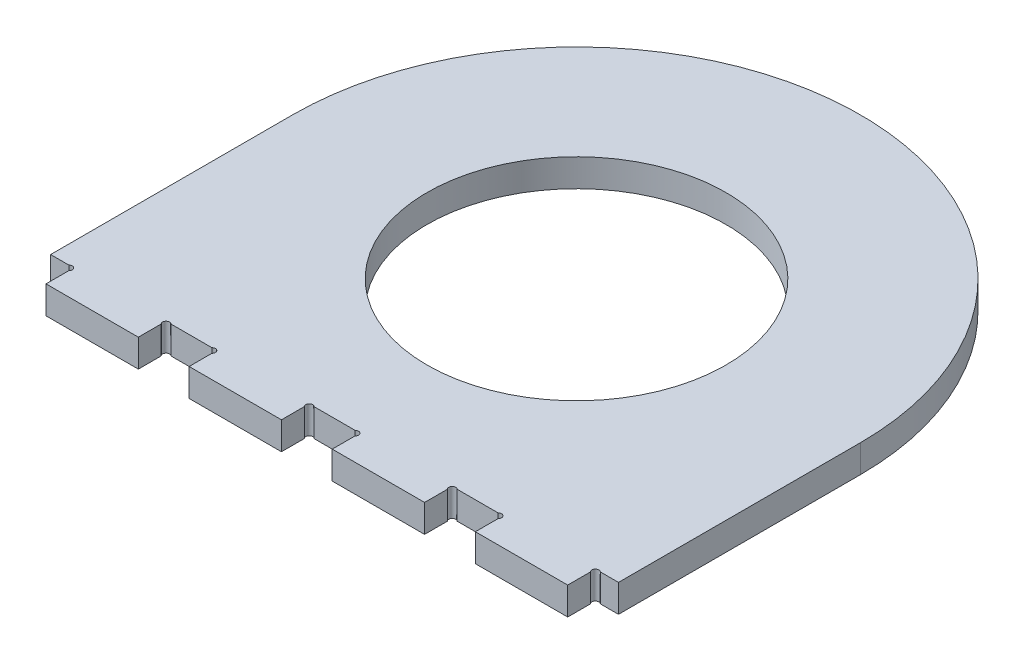
ISO-10303-21;
HEADER;
FILE_DESCRIPTION(('STEP AP214'),'2;1');
FILE_NAME('part.step','',(''),(''),'','','');
FILE_SCHEMA(('AUTOMOTIVE_DESIGN { 1 0 10303 214 1 1 1 1 }'));
ENDSEC;
DATA;
#1=APPLICATION_CONTEXT('core data for automotive mechanical design processes');
#2=APPLICATION_PROTOCOL_DEFINITION('international standard','automotive_design',2000,#1);
#3=PRODUCT_CONTEXT('',#1,'mechanical');
#4=PRODUCT('Part','Part','',(#3));
#5=PRODUCT_RELATED_PRODUCT_CATEGORY('part','',(#4));
#6=PRODUCT_DEFINITION_FORMATION('','',#4);
#7=PRODUCT_DEFINITION_CONTEXT('part definition',#1,'design');
#8=PRODUCT_DEFINITION('design','',#6,#7);
#9=PRODUCT_DEFINITION_SHAPE('','',#8);
#10=(LENGTH_UNIT() NAMED_UNIT(*) SI_UNIT(.MILLI.,.METRE.));
#11=(NAMED_UNIT(*) PLANE_ANGLE_UNIT() SI_UNIT($,.RADIAN.));
#12=(NAMED_UNIT(*) SI_UNIT($,.STERADIAN.) SOLID_ANGLE_UNIT());
#13=UNCERTAINTY_MEASURE_WITH_UNIT(LENGTH_MEASURE(1.E-05),#10,'distance_accuracy_value','');
#14=(GEOMETRIC_REPRESENTATION_CONTEXT(3) GLOBAL_UNCERTAINTY_ASSIGNED_CONTEXT((#13)) GLOBAL_UNIT_ASSIGNED_CONTEXT((#10,
#11,#12)) REPRESENTATION_CONTEXT('',''));
#15=CARTESIAN_POINT('',(0.,0.,0.));
#16=DIRECTION('',(0.,0.,1.));
#17=DIRECTION('',(1.,0.,0.));
#18=AXIS2_PLACEMENT_3D('',#15,#16,#17);
#19=CARTESIAN_POINT('',(180.,12.,-104.820295073944));
#20=DIRECTION('',(0.,1.,0.));
#21=DIRECTION('',(0.,0.,1.));
#22=AXIS2_PLACEMENT_3D('',#19,#20,#21);
#23=PLANE('',#22);
#24=DIRECTION('',(0.,0.,-1.));
#25=VECTOR('',#24,1.);
#26=CARTESIAN_POINT('',(303.,12.,0.));
#27=LINE('',#26,#25);
#28=CARTESIAN_POINT('',(303.,12.,0.));
#29=VERTEX_POINT('',#28);
#30=CARTESIAN_POINT('',(303.,12.,-104.820295073944));
#31=VERTEX_POINT('',#30);
#32=EDGE_CURVE('E304',#29,#31,#27,.T.);
#33=ORIENTED_EDGE('',*,*,#32,.T.);
#34=CARTESIAN_POINT('',(180.,12.,-104.820295073944));
#35=DIRECTION('',(0.,1.,0.));
#36=DIRECTION('',(0.,0.,1.));
#37=AXIS2_PLACEMENT_3D('',#34,#35,#36);
#38=CIRCLE('',#37,123.);
#39=CARTESIAN_POINT('',(57.,12.,-104.820295073944));
#40=VERTEX_POINT('',#39);
#41=EDGE_CURVE('E152',#31,#40,#38,.T.);
#42=ORIENTED_EDGE('',*,*,#41,.T.);
#43=DIRECTION('',(0.,0.,1.));
#44=VECTOR('',#43,1.);
#45=CARTESIAN_POINT('',(57.,12.,0.));
#46=LINE('',#45,#44);
#47=CARTESIAN_POINT('',(57.,12.,0.));
#48=VERTEX_POINT('',#47);
#49=EDGE_CURVE('E379',#40,#48,#46,.T.);
#50=ORIENTED_EDGE('',*,*,#49,.T.);
#51=DIRECTION('',(1.,0.,0.));
#52=VECTOR('',#51,1.);
#53=CARTESIAN_POINT('',(57.,12.,0.));
#54=LINE('',#53,#52);
#55=CARTESIAN_POINT('',(64.8786796564404,12.,0.));
#56=VERTEX_POINT('',#55);
#57=EDGE_CURVE('E398',#48,#56,#54,.T.);
#58=ORIENTED_EDGE('',*,*,#57,.T.);
#59=CARTESIAN_POINT('',(65.9393398282202,12.,1.06066017177982));
#60=DIRECTION('',(0.,-1.,0.));
#61=DIRECTION('',(0.,0.,1.));
#62=AXIS2_PLACEMENT_3D('',#59,#60,#61);
#63=CIRCLE('',#62,1.5);
#64=CARTESIAN_POINT('',(67.,12.,2.12132034355964));
#65=VERTEX_POINT('',#64);
#66=EDGE_CURVE('E395',#56,#65,#63,.T.);
#67=ORIENTED_EDGE('',*,*,#66,.T.);
#68=DIRECTION('',(0.,0.,1.));
#69=VECTOR('',#68,1.);
#70=CARTESIAN_POINT('',(67.,12.,2.12132034355964));
#71=LINE('',#70,#69);
#72=CARTESIAN_POINT('',(67.,12.,12.));
#73=VERTEX_POINT('',#72);
#74=EDGE_CURVE('E397',#65,#73,#71,.T.);
#75=ORIENTED_EDGE('',*,*,#74,.T.);
#76=DIRECTION('',(1.,0.,0.));
#77=VECTOR('',#76,1.);
#78=CARTESIAN_POINT('',(67.,12.,12.));
#79=LINE('',#78,#77);
#80=CARTESIAN_POINT('',(107.,12.,12.));
#81=VERTEX_POINT('',#80);
#82=EDGE_CURVE('E400',#73,#81,#79,.T.);
#83=ORIENTED_EDGE('',*,*,#82,.T.);
#84=DIRECTION('',(0.,0.,-1.));
#85=VECTOR('',#84,1.);
#86=CARTESIAN_POINT('',(107.,12.,12.));
#87=LINE('',#86,#85);
#88=CARTESIAN_POINT('',(107.,12.,2.12132034355962));
#89=VERTEX_POINT('',#88);
#90=EDGE_CURVE('E406',#81,#89,#87,.T.);
#91=ORIENTED_EDGE('',*,*,#90,.T.);
#92=CARTESIAN_POINT('',(108.06066017178,12.,1.06066017177981));
#93=DIRECTION('',(0.,-1.,0.));
#94=DIRECTION('',(0.,0.,1.));
#95=AXIS2_PLACEMENT_3D('',#92,#93,#94);
#96=CIRCLE('',#95,1.5);
#97=CARTESIAN_POINT('',(109.12132034356,12.,0.));
#98=VERTEX_POINT('',#97);
#99=EDGE_CURVE('E408',#89,#98,#96,.T.);
#100=ORIENTED_EDGE('',*,*,#99,.T.);
#101=DIRECTION('',(1.,0.,0.));
#102=VECTOR('',#101,1.);
#103=CARTESIAN_POINT('',(109.12132034356,12.,0.));
#104=LINE('',#103,#102);
#105=CARTESIAN_POINT('',(126.87867965644,12.,0.));
#106=VERTEX_POINT('',#105);
#107=EDGE_CURVE('E410',#98,#106,#104,.T.);
#108=ORIENTED_EDGE('',*,*,#107,.T.);
#109=CARTESIAN_POINT('',(127.93933982822,12.,1.06066017177981));
#110=DIRECTION('',(0.,-1.,0.));
#111=DIRECTION('',(0.,0.,1.));
#112=AXIS2_PLACEMENT_3D('',#109,#110,#111);
#113=CIRCLE('',#112,1.49999999999996);
#114=CARTESIAN_POINT('',(129.,12.,2.1213203435596));
#115=VERTEX_POINT('',#114);
#116=EDGE_CURVE('E412',#106,#115,#113,.T.);
#117=ORIENTED_EDGE('',*,*,#116,.T.);
#118=DIRECTION('',(0.,0.,1.));
#119=VECTOR('',#118,1.);
#120=CARTESIAN_POINT('',(129.,12.,2.1213203435596));
#121=LINE('',#120,#119);
#122=CARTESIAN_POINT('',(129.,12.,12.));
#123=VERTEX_POINT('',#122);
#124=EDGE_CURVE('E414',#115,#123,#121,.T.);
#125=ORIENTED_EDGE('',*,*,#124,.T.);
#126=DIRECTION('',(1.,0.,0.));
#127=VECTOR('',#126,1.);
#128=CARTESIAN_POINT('',(129.,12.,12.));
#129=LINE('',#128,#127);
#130=CARTESIAN_POINT('',(169.,12.,12.));
#131=VERTEX_POINT('',#130);
#132=EDGE_CURVE('E416',#123,#131,#129,.T.);
#133=ORIENTED_EDGE('',*,*,#132,.T.);
#134=DIRECTION('',(0.,0.,-1.));
#135=VECTOR('',#134,1.);
#136=CARTESIAN_POINT('',(169.,12.,12.));
#137=LINE('',#136,#135);
#138=CARTESIAN_POINT('',(169.,12.,2.12132034355962));
#139=VERTEX_POINT('',#138);
#140=EDGE_CURVE('E418',#131,#139,#137,.T.);
#141=ORIENTED_EDGE('',*,*,#140,.T.);
#142=CARTESIAN_POINT('',(170.06066017178,12.,1.06066017177981));
#143=DIRECTION('',(0.,-1.,0.));
#144=DIRECTION('',(0.,0.,1.));
#145=AXIS2_PLACEMENT_3D('',#142,#143,#144);
#146=CIRCLE('',#145,1.5);
#147=CARTESIAN_POINT('',(171.12132034356,12.,0.));
#148=VERTEX_POINT('',#147);
#149=EDGE_CURVE('E420',#139,#148,#146,.T.);
#150=ORIENTED_EDGE('',*,*,#149,.T.);
#151=DIRECTION('',(1.,0.,0.));
#152=VECTOR('',#151,1.);
#153=CARTESIAN_POINT('',(171.12132034356,12.,0.));
#154=LINE('',#153,#152);
#155=CARTESIAN_POINT('',(188.87867965644,12.,0.));
#156=VERTEX_POINT('',#155);
#157=EDGE_CURVE('E422',#148,#156,#154,.T.);
#158=ORIENTED_EDGE('',*,*,#157,.T.);
#159=CARTESIAN_POINT('',(189.93933982822,12.,1.06066017177981));
#160=DIRECTION('',(0.,-1.,0.));
#161=DIRECTION('',(0.,0.,1.));
#162=AXIS2_PLACEMENT_3D('',#159,#160,#161);
#163=CIRCLE('',#162,1.49999999999996);
#164=CARTESIAN_POINT('',(191.,12.,2.1213203435596));
#165=VERTEX_POINT('',#164);
#166=EDGE_CURVE('E424',#156,#165,#163,.T.);
#167=ORIENTED_EDGE('',*,*,#166,.T.);
#168=DIRECTION('',(0.,0.,1.));
#169=VECTOR('',#168,1.);
#170=CARTESIAN_POINT('',(191.,12.,2.1213203435596));
#171=LINE('',#170,#169);
#172=CARTESIAN_POINT('',(191.,12.,12.));
#173=VERTEX_POINT('',#172);
#174=EDGE_CURVE('E426',#165,#173,#171,.T.);
#175=ORIENTED_EDGE('',*,*,#174,.T.);
#176=DIRECTION('',(1.,0.,0.));
#177=VECTOR('',#176,1.);
#178=CARTESIAN_POINT('',(191.,12.,12.));
#179=LINE('',#178,#177);
#180=CARTESIAN_POINT('',(231.,12.,12.));
#181=VERTEX_POINT('',#180);
#182=EDGE_CURVE('E428',#173,#181,#179,.T.);
#183=ORIENTED_EDGE('',*,*,#182,.T.);
#184=DIRECTION('',(0.,0.,-1.));
#185=VECTOR('',#184,1.);
#186=CARTESIAN_POINT('',(231.,12.,12.));
#187=LINE('',#186,#185);
#188=CARTESIAN_POINT('',(231.,12.,2.12132034355962));
#189=VERTEX_POINT('',#188);
#190=EDGE_CURVE('E430',#181,#189,#187,.T.);
#191=ORIENTED_EDGE('',*,*,#190,.T.);
#192=CARTESIAN_POINT('',(232.06066017178,12.,1.06066017177981));
#193=DIRECTION('',(0.,-1.,0.));
#194=DIRECTION('',(0.,0.,1.));
#195=AXIS2_PLACEMENT_3D('',#192,#193,#194);
#196=CIRCLE('',#195,1.5);
#197=CARTESIAN_POINT('',(233.12132034356,12.,0.));
#198=VERTEX_POINT('',#197);
#199=EDGE_CURVE('E432',#189,#198,#196,.T.);
#200=ORIENTED_EDGE('',*,*,#199,.T.);
#201=DIRECTION('',(1.,0.,0.));
#202=VECTOR('',#201,1.);
#203=CARTESIAN_POINT('',(233.12132034356,12.,0.));
#204=LINE('',#203,#202);
#205=CARTESIAN_POINT('',(250.87867965644,12.,0.));
#206=VERTEX_POINT('',#205);
#207=EDGE_CURVE('E434',#198,#206,#204,.T.);
#208=ORIENTED_EDGE('',*,*,#207,.T.);
#209=CARTESIAN_POINT('',(251.93933982822,12.,1.06066017177981));
#210=DIRECTION('',(0.,-1.,0.));
#211=DIRECTION('',(0.,0.,1.));
#212=AXIS2_PLACEMENT_3D('',#209,#210,#211);
#213=CIRCLE('',#212,1.49999999999997);
#214=CARTESIAN_POINT('',(253.,12.,2.1213203435596));
#215=VERTEX_POINT('',#214);
#216=EDGE_CURVE('E436',#206,#215,#213,.T.);
#217=ORIENTED_EDGE('',*,*,#216,.T.);
#218=DIRECTION('',(0.,0.,1.));
#219=VECTOR('',#218,1.);
#220=CARTESIAN_POINT('',(253.,12.,2.1213203435596));
#221=LINE('',#220,#219);
#222=CARTESIAN_POINT('',(253.,12.,12.));
#223=VERTEX_POINT('',#222);
#224=EDGE_CURVE('E438',#215,#223,#221,.T.);
#225=ORIENTED_EDGE('',*,*,#224,.T.);
#226=DIRECTION('',(1.,0.,0.));
#227=VECTOR('',#226,1.);
#228=CARTESIAN_POINT('',(253.,12.,12.));
#229=LINE('',#228,#227);
#230=CARTESIAN_POINT('',(293.,12.,12.));
#231=VERTEX_POINT('',#230);
#232=EDGE_CURVE('E231',#223,#231,#229,.T.);
#233=ORIENTED_EDGE('',*,*,#232,.T.);
#234=DIRECTION('',(0.,0.,-1.));
#235=VECTOR('',#234,1.);
#236=CARTESIAN_POINT('',(293.,12.,12.));
#237=LINE('',#236,#235);
#238=CARTESIAN_POINT('',(293.,12.,2.12132034355962));
#239=VERTEX_POINT('',#238);
#240=EDGE_CURVE('E225',#231,#239,#237,.T.);
#241=ORIENTED_EDGE('',*,*,#240,.T.);
#242=CARTESIAN_POINT('',(294.06066017178,12.,1.06066017177981));
#243=DIRECTION('',(0.,-1.,0.));
#244=DIRECTION('',(0.,0.,1.));
#245=AXIS2_PLACEMENT_3D('',#242,#243,#244);
#246=CIRCLE('',#245,1.50000000000002);
#247=CARTESIAN_POINT('',(295.12132034356,12.,0.));
#248=VERTEX_POINT('',#247);
#249=EDGE_CURVE('E229',#239,#248,#246,.T.);
#250=ORIENTED_EDGE('',*,*,#249,.T.);
#251=DIRECTION('',(1.,0.,0.));
#252=VECTOR('',#251,1.);
#253=CARTESIAN_POINT('',(295.12132034356,12.,0.));
#254=LINE('',#253,#252);
#255=EDGE_CURVE('E49',#248,#29,#254,.T.);
#256=ORIENTED_EDGE('',*,*,#255,.T.);
#257=EDGE_LOOP('',(#33,#42,#50,#58,#67,#75,#83,#91,#100,#108,#117,#125,#133,#141,#150,#158,#167,
#175,#183,#191,#200,#208,#217,#225,#233,#241,#250,#256));
#258=FACE_BOUND('',#257,.T.);
#259=CARTESIAN_POINT('',(180.,12.,-104.820295073944));
#260=DIRECTION('',(0.,1.,0.));
#261=DIRECTION('',(0.,0.,1.));
#262=AXIS2_PLACEMENT_3D('',#259,#260,#261);
#263=CIRCLE('',#262,64.75);
#264=CARTESIAN_POINT('',(180.,12.,-40.0702950739442));
#265=VERTEX_POINT('',#264);
#266=EDGE_CURVE('E253',#265,#265,#263,.T.);
#267=ORIENTED_EDGE('',*,*,#266,.F.);
#268=EDGE_LOOP('',(#267));
#269=FACE_BOUND('',#268,.T.);
#270=ADVANCED_FACE('F32',(#258,#269),#23,.T.);
#271=CARTESIAN_POINT('',(180.,0.,-104.820295073944));
#272=DIRECTION('',(0.,1.,0.));
#273=DIRECTION('',(0.,0.,1.));
#274=AXIS2_PLACEMENT_3D('',#271,#272,#273);
#275=PLANE('',#274);
#276=DIRECTION('',(0.,0.,-1.));
#277=VECTOR('',#276,1.);
#278=CARTESIAN_POINT('',(303.,0.,0.));
#279=LINE('',#278,#277);
#280=CARTESIAN_POINT('',(303.,0.,0.));
#281=VERTEX_POINT('',#280);
#282=CARTESIAN_POINT('',(303.,0.,-104.820295073944));
#283=VERTEX_POINT('',#282);
#284=EDGE_CURVE('E249',#281,#283,#279,.T.);
#285=ORIENTED_EDGE('',*,*,#284,.F.);
#286=DIRECTION('',(1.,0.,0.));
#287=VECTOR('',#286,1.);
#288=CARTESIAN_POINT('',(295.12132034356,0.,0.));
#289=LINE('',#288,#287);
#290=CARTESIAN_POINT('',(295.12132034356,0.,0.));
#291=VERTEX_POINT('',#290);
#292=EDGE_CURVE('E144',#291,#281,#289,.T.);
#293=ORIENTED_EDGE('',*,*,#292,.F.);
#294=CARTESIAN_POINT('',(294.06066017178,0.,1.06066017177981));
#295=DIRECTION('',(0.,-1.,0.));
#296=DIRECTION('',(0.,0.,1.));
#297=AXIS2_PLACEMENT_3D('',#294,#295,#296);
#298=CIRCLE('',#297,1.50000000000002);
#299=CARTESIAN_POINT('',(293.,0.,2.12132034355962));
#300=VERTEX_POINT('',#299);
#301=EDGE_CURVE('E138',#300,#291,#298,.T.);
#302=ORIENTED_EDGE('',*,*,#301,.F.);
#303=DIRECTION('',(0.,0.,-1.));
#304=VECTOR('',#303,1.);
#305=CARTESIAN_POINT('',(293.,0.,12.));
#306=LINE('',#305,#304);
#307=CARTESIAN_POINT('',(293.,0.,12.));
#308=VERTEX_POINT('',#307);
#309=EDGE_CURVE('E239',#308,#300,#306,.T.);
#310=ORIENTED_EDGE('',*,*,#309,.F.);
#311=DIRECTION('',(1.,0.,0.));
#312=VECTOR('',#311,1.);
#313=CARTESIAN_POINT('',(253.,0.,12.));
#314=LINE('',#313,#312);
#315=CARTESIAN_POINT('',(253.,0.,12.));
#316=VERTEX_POINT('',#315);
#317=EDGE_CURVE('E299',#316,#308,#314,.T.);
#318=ORIENTED_EDGE('',*,*,#317,.F.);
#319=DIRECTION('',(0.,0.,1.));
#320=VECTOR('',#319,1.);
#321=CARTESIAN_POINT('',(253.,0.,2.1213203435596));
#322=LINE('',#321,#320);
#323=CARTESIAN_POINT('',(253.,0.,2.1213203435596));
#324=VERTEX_POINT('',#323);
#325=EDGE_CURVE('E297',#324,#316,#322,.T.);
#326=ORIENTED_EDGE('',*,*,#325,.F.);
#327=CARTESIAN_POINT('',(251.93933982822,0.,1.06066017177981));
#328=DIRECTION('',(0.,-1.,0.));
#329=DIRECTION('',(0.,0.,1.));
#330=AXIS2_PLACEMENT_3D('',#327,#328,#329);
#331=CIRCLE('',#330,1.49999999999997);
#332=CARTESIAN_POINT('',(250.87867965644,0.,0.));
#333=VERTEX_POINT('',#332);
#334=EDGE_CURVE('E295',#333,#324,#331,.T.);
#335=ORIENTED_EDGE('',*,*,#334,.F.);
#336=DIRECTION('',(1.,0.,0.));
#337=VECTOR('',#336,1.);
#338=CARTESIAN_POINT('',(233.12132034356,0.,0.));
#339=LINE('',#338,#337);
#340=CARTESIAN_POINT('',(233.12132034356,0.,0.));
#341=VERTEX_POINT('',#340);
#342=EDGE_CURVE('E293',#341,#333,#339,.T.);
#343=ORIENTED_EDGE('',*,*,#342,.F.);
#344=CARTESIAN_POINT('',(232.06066017178,0.,1.06066017177981));
#345=DIRECTION('',(0.,-1.,0.));
#346=DIRECTION('',(0.,0.,1.));
#347=AXIS2_PLACEMENT_3D('',#344,#345,#346);
#348=CIRCLE('',#347,1.5);
#349=CARTESIAN_POINT('',(231.,0.,2.12132034355962));
#350=VERTEX_POINT('',#349);
#351=EDGE_CURVE('E291',#350,#341,#348,.T.);
#352=ORIENTED_EDGE('',*,*,#351,.F.);
#353=DIRECTION('',(0.,0.,-1.));
#354=VECTOR('',#353,1.);
#355=CARTESIAN_POINT('',(231.,0.,12.));
#356=LINE('',#355,#354);
#357=CARTESIAN_POINT('',(231.,0.,12.));
#358=VERTEX_POINT('',#357);
#359=EDGE_CURVE('E289',#358,#350,#356,.T.);
#360=ORIENTED_EDGE('',*,*,#359,.F.);
#361=DIRECTION('',(1.,0.,0.));
#362=VECTOR('',#361,1.);
#363=CARTESIAN_POINT('',(191.,0.,12.));
#364=LINE('',#363,#362);
#365=CARTESIAN_POINT('',(191.,0.,12.));
#366=VERTEX_POINT('',#365);
#367=EDGE_CURVE('E287',#366,#358,#364,.T.);
#368=ORIENTED_EDGE('',*,*,#367,.F.);
#369=DIRECTION('',(0.,0.,1.));
#370=VECTOR('',#369,1.);
#371=CARTESIAN_POINT('',(191.,0.,2.1213203435596));
#372=LINE('',#371,#370);
#373=CARTESIAN_POINT('',(191.,0.,2.1213203435596));
#374=VERTEX_POINT('',#373);
#375=EDGE_CURVE('E285',#374,#366,#372,.T.);
#376=ORIENTED_EDGE('',*,*,#375,.F.);
#377=CARTESIAN_POINT('',(189.93933982822,0.,1.06066017177981));
#378=DIRECTION('',(0.,-1.,0.));
#379=DIRECTION('',(0.,0.,1.));
#380=AXIS2_PLACEMENT_3D('',#377,#378,#379);
#381=CIRCLE('',#380,1.49999999999996);
#382=CARTESIAN_POINT('',(188.87867965644,0.,0.));
#383=VERTEX_POINT('',#382);
#384=EDGE_CURVE('E283',#383,#374,#381,.T.);
#385=ORIENTED_EDGE('',*,*,#384,.F.);
#386=DIRECTION('',(1.,0.,0.));
#387=VECTOR('',#386,1.);
#388=CARTESIAN_POINT('',(171.12132034356,0.,0.));
#389=LINE('',#388,#387);
#390=CARTESIAN_POINT('',(171.12132034356,0.,0.));
#391=VERTEX_POINT('',#390);
#392=EDGE_CURVE('E281',#391,#383,#389,.T.);
#393=ORIENTED_EDGE('',*,*,#392,.F.);
#394=CARTESIAN_POINT('',(170.06066017178,0.,1.06066017177981));
#395=DIRECTION('',(0.,-1.,0.));
#396=DIRECTION('',(0.,0.,1.));
#397=AXIS2_PLACEMENT_3D('',#394,#395,#396);
#398=CIRCLE('',#397,1.5);
#399=CARTESIAN_POINT('',(169.,0.,2.12132034355962));
#400=VERTEX_POINT('',#399);
#401=EDGE_CURVE('E279',#400,#391,#398,.T.);
#402=ORIENTED_EDGE('',*,*,#401,.F.);
#403=DIRECTION('',(0.,0.,-1.));
#404=VECTOR('',#403,1.);
#405=CARTESIAN_POINT('',(169.,0.,12.));
#406=LINE('',#405,#404);
#407=CARTESIAN_POINT('',(169.,0.,12.));
#408=VERTEX_POINT('',#407);
#409=EDGE_CURVE('E277',#408,#400,#406,.T.);
#410=ORIENTED_EDGE('',*,*,#409,.F.);
#411=DIRECTION('',(1.,0.,0.));
#412=VECTOR('',#411,1.);
#413=CARTESIAN_POINT('',(129.,0.,12.));
#414=LINE('',#413,#412);
#415=CARTESIAN_POINT('',(129.,0.,12.));
#416=VERTEX_POINT('',#415);
#417=EDGE_CURVE('E275',#416,#408,#414,.T.);
#418=ORIENTED_EDGE('',*,*,#417,.F.);
#419=DIRECTION('',(0.,0.,1.));
#420=VECTOR('',#419,1.);
#421=CARTESIAN_POINT('',(129.,0.,2.1213203435596));
#422=LINE('',#421,#420);
#423=CARTESIAN_POINT('',(129.,0.,2.1213203435596));
#424=VERTEX_POINT('',#423);
#425=EDGE_CURVE('E273',#424,#416,#422,.T.);
#426=ORIENTED_EDGE('',*,*,#425,.F.);
#427=CARTESIAN_POINT('',(127.93933982822,0.,1.06066017177981));
#428=DIRECTION('',(0.,-1.,0.));
#429=DIRECTION('',(0.,0.,1.));
#430=AXIS2_PLACEMENT_3D('',#427,#428,#429);
#431=CIRCLE('',#430,1.49999999999996);
#432=CARTESIAN_POINT('',(126.87867965644,0.,0.));
#433=VERTEX_POINT('',#432);
#434=EDGE_CURVE('E271',#433,#424,#431,.T.);
#435=ORIENTED_EDGE('',*,*,#434,.F.);
#436=DIRECTION('',(1.,0.,0.));
#437=VECTOR('',#436,1.);
#438=CARTESIAN_POINT('',(109.12132034356,0.,0.));
#439=LINE('',#438,#437);
#440=CARTESIAN_POINT('',(109.12132034356,0.,0.));
#441=VERTEX_POINT('',#440);
#442=EDGE_CURVE('E269',#441,#433,#439,.T.);
#443=ORIENTED_EDGE('',*,*,#442,.F.);
#444=CARTESIAN_POINT('',(108.06066017178,0.,1.06066017177981));
#445=DIRECTION('',(0.,-1.,0.));
#446=DIRECTION('',(0.,0.,1.));
#447=AXIS2_PLACEMENT_3D('',#444,#445,#446);
#448=CIRCLE('',#447,1.5);
#449=CARTESIAN_POINT('',(107.,0.,2.12132034355962));
#450=VERTEX_POINT('',#449);
#451=EDGE_CURVE('E267',#450,#441,#448,.T.);
#452=ORIENTED_EDGE('',*,*,#451,.F.);
#453=DIRECTION('',(0.,0.,-1.));
#454=VECTOR('',#453,1.);
#455=CARTESIAN_POINT('',(107.,0.,12.));
#456=LINE('',#455,#454);
#457=CARTESIAN_POINT('',(107.,0.,12.));
#458=VERTEX_POINT('',#457);
#459=EDGE_CURVE('E265',#458,#450,#456,.T.);
#460=ORIENTED_EDGE('',*,*,#459,.F.);
#461=DIRECTION('',(1.,0.,0.));
#462=VECTOR('',#461,1.);
#463=CARTESIAN_POINT('',(67.,0.,12.));
#464=LINE('',#463,#462);
#465=CARTESIAN_POINT('',(67.,0.,12.));
#466=VERTEX_POINT('',#465);
#467=EDGE_CURVE('E263',#466,#458,#464,.T.);
#468=ORIENTED_EDGE('',*,*,#467,.F.);
#469=DIRECTION('',(0.,0.,1.));
#470=VECTOR('',#469,1.);
#471=CARTESIAN_POINT('',(67.,0.,2.12132034355964));
#472=LINE('',#471,#470);
#473=CARTESIAN_POINT('',(67.,0.,2.12132034355964));
#474=VERTEX_POINT('',#473);
#475=EDGE_CURVE('E261',#474,#466,#472,.T.);
#476=ORIENTED_EDGE('',*,*,#475,.F.);
#477=CARTESIAN_POINT('',(65.9393398282202,0.,1.06066017177982));
#478=DIRECTION('',(0.,-1.,0.));
#479=DIRECTION('',(0.,0.,1.));
#480=AXIS2_PLACEMENT_3D('',#477,#478,#479);
#481=CIRCLE('',#480,1.5);
#482=CARTESIAN_POINT('',(64.8786796564404,0.,0.));
#483=VERTEX_POINT('',#482);
#484=EDGE_CURVE('E259',#483,#474,#481,.T.);
#485=ORIENTED_EDGE('',*,*,#484,.F.);
#486=DIRECTION('',(1.,0.,0.));
#487=VECTOR('',#486,1.);
#488=CARTESIAN_POINT('',(57.,0.,0.));
#489=LINE('',#488,#487);
#490=CARTESIAN_POINT('',(57.,0.,0.));
#491=VERTEX_POINT('',#490);
#492=EDGE_CURVE('E257',#491,#483,#489,.T.);
#493=ORIENTED_EDGE('',*,*,#492,.F.);
#494=DIRECTION('',(0.,0.,1.));
#495=VECTOR('',#494,1.);
#496=CARTESIAN_POINT('',(57.,0.,0.));
#497=LINE('',#496,#495);
#498=CARTESIAN_POINT('',(57.,0.,-104.820295073944));
#499=VERTEX_POINT('',#498);
#500=EDGE_CURVE('E255',#499,#491,#497,.T.);
#501=ORIENTED_EDGE('',*,*,#500,.F.);
#502=CARTESIAN_POINT('',(180.,0.,-104.820295073944));
#503=DIRECTION('',(0.,1.,0.));
#504=DIRECTION('',(0.,0.,1.));
#505=AXIS2_PLACEMENT_3D('',#502,#503,#504);
#506=CIRCLE('',#505,123.);
#507=EDGE_CURVE('E252',#283,#499,#506,.T.);
#508=ORIENTED_EDGE('',*,*,#507,.F.);
#509=EDGE_LOOP('',(#285,#293,#302,#310,#318,#326,#335,#343,#352,#360,#368,#376,#385,#393,#402,
#410,#418,#426,#435,#443,#452,#460,#468,#476,#485,#493,#501,#508));
#510=FACE_BOUND('',#509,.T.);
#511=CARTESIAN_POINT('',(180.,0.,-104.820295073944));
#512=DIRECTION('',(0.,1.,0.));
#513=DIRECTION('',(0.,0.,1.));
#514=AXIS2_PLACEMENT_3D('',#511,#512,#513);
#515=CIRCLE('',#514,64.75);
#516=CARTESIAN_POINT('',(180.,0.,-40.0702950739442));
#517=VERTEX_POINT('',#516);
#518=EDGE_CURVE('E793',#517,#517,#515,.T.);
#519=ORIENTED_EDGE('',*,*,#518,.T.);
#520=EDGE_LOOP('',(#519));
#521=FACE_BOUND('',#520,.T.);
#522=ADVANCED_FACE('F383',(#510,#521),#275,.F.);
#523=CARTESIAN_POINT('',(303.,12.,0.));
#524=DIRECTION('',(-1.,0.,0.));
#525=DIRECTION('',(0.,0.,1.));
#526=AXIS2_PLACEMENT_3D('',#523,#524,#525);
#527=PLANE('',#526);
#528=ORIENTED_EDGE('',*,*,#284,.T.);
#529=DIRECTION('',(0.,-1.,0.));
#530=VECTOR('',#529,1.);
#531=CARTESIAN_POINT('',(303.,12.,-104.820295073944));
#532=LINE('',#531,#530);
#533=EDGE_CURVE('E11',#31,#283,#532,.T.);
#534=ORIENTED_EDGE('',*,*,#533,.F.);
#535=ORIENTED_EDGE('',*,*,#32,.F.);
#536=DIRECTION('',(0.,-1.,0.));
#537=VECTOR('',#536,1.);
#538=CARTESIAN_POINT('',(303.,12.,0.));
#539=LINE('',#538,#537);
#540=EDGE_CURVE('E245',#29,#281,#539,.T.);
#541=ORIENTED_EDGE('',*,*,#540,.T.);
#542=EDGE_LOOP('',(#528,#534,#535,#541));
#543=FACE_BOUND('',#542,.T.);
#544=ADVANCED_FACE('F34',(#543),#527,.F.);
#545=CARTESIAN_POINT('',(180.,12.,-104.820295073944));
#546=DIRECTION('',(0.,-1.,0.));
#547=DIRECTION('',(0.,0.,-1.));
#548=AXIS2_PLACEMENT_3D('',#545,#546,#547);
#549=CYLINDRICAL_SURFACE('',#548,123.);
#550=ORIENTED_EDGE('',*,*,#507,.T.);
#551=DIRECTION('',(0.,-1.,0.));
#552=VECTOR('',#551,1.);
#553=CARTESIAN_POINT('',(57.,12.,-104.820295073944));
#554=LINE('',#553,#552);
#555=EDGE_CURVE('E41',#40,#499,#554,.T.);
#556=ORIENTED_EDGE('',*,*,#555,.F.);
#557=ORIENTED_EDGE('',*,*,#41,.F.);
#558=ORIENTED_EDGE('',*,*,#533,.T.);
#559=EDGE_LOOP('',(#550,#556,#557,#558));
#560=FACE_BOUND('',#559,.T.);
#561=ADVANCED_FACE('F472',(#560),#549,.T.);
#562=CARTESIAN_POINT('',(57.,12.,0.));
#563=DIRECTION('',(1.,0.,0.));
#564=DIRECTION('',(0.,0.,-1.));
#565=AXIS2_PLACEMENT_3D('',#562,#563,#564);
#566=PLANE('',#565);
#567=ORIENTED_EDGE('',*,*,#500,.T.);
#568=DIRECTION('',(0.,-1.,0.));
#569=VECTOR('',#568,1.);
#570=CARTESIAN_POINT('',(57.,12.,0.));
#571=LINE('',#570,#569);
#572=EDGE_CURVE('E371',#48,#491,#571,.T.);
#573=ORIENTED_EDGE('',*,*,#572,.F.);
#574=ORIENTED_EDGE('',*,*,#49,.F.);
#575=ORIENTED_EDGE('',*,*,#555,.T.);
#576=EDGE_LOOP('',(#567,#573,#574,#575));
#577=FACE_BOUND('',#576,.T.);
#578=ADVANCED_FACE('F377',(#577),#566,.F.);
#579=CARTESIAN_POINT('',(57.,12.,0.));
#580=DIRECTION('',(0.,0.,-1.));
#581=DIRECTION('',(-1.,0.,0.));
#582=AXIS2_PLACEMENT_3D('',#579,#580,#581);
#583=PLANE('',#582);
#584=ORIENTED_EDGE('',*,*,#492,.T.);
#585=DIRECTION('',(0.,-1.,0.));
#586=VECTOR('',#585,1.);
#587=CARTESIAN_POINT('',(64.8786796564404,12.,0.));
#588=LINE('',#587,#586);
#589=EDGE_CURVE('E368',#56,#483,#588,.T.);
#590=ORIENTED_EDGE('',*,*,#589,.F.);
#591=ORIENTED_EDGE('',*,*,#57,.F.);
#592=ORIENTED_EDGE('',*,*,#572,.T.);
#593=EDGE_LOOP('',(#584,#590,#591,#592));
#594=FACE_BOUND('',#593,.T.);
#595=ADVANCED_FACE('F389',(#594),#583,.F.);
#596=CARTESIAN_POINT('',(65.9393398282202,12.,1.06066017177982));
#597=DIRECTION('',(0.,-1.,0.));
#598=DIRECTION('',(0.,0.,-1.));
#599=AXIS2_PLACEMENT_3D('',#596,#597,#598);
#600=CYLINDRICAL_SURFACE('',#599,1.5);
#601=ORIENTED_EDGE('',*,*,#484,.T.);
#602=DIRECTION('',(0.,-1.,0.));
#603=VECTOR('',#602,1.);
#604=CARTESIAN_POINT('',(67.,12.,2.12132034355964));
#605=LINE('',#604,#603);
#606=EDGE_CURVE('E365',#65,#474,#605,.T.);
#607=ORIENTED_EDGE('',*,*,#606,.F.);
#608=ORIENTED_EDGE('',*,*,#66,.F.);
#609=ORIENTED_EDGE('',*,*,#589,.T.);
#610=EDGE_LOOP('',(#601,#607,#608,#609));
#611=FACE_BOUND('',#610,.T.);
#612=ADVANCED_FACE('F393',(#611),#600,.F.);
#613=CARTESIAN_POINT('',(67.,12.,2.12132034355964));
#614=DIRECTION('',(1.,0.,0.));
#615=DIRECTION('',(0.,0.,-1.));
#616=AXIS2_PLACEMENT_3D('',#613,#614,#615);
#617=PLANE('',#616);
#618=ORIENTED_EDGE('',*,*,#475,.T.);
#619=DIRECTION('',(0.,-1.,0.));
#620=VECTOR('',#619,1.);
#621=CARTESIAN_POINT('',(67.,12.,12.));
#622=LINE('',#621,#620);
#623=EDGE_CURVE('E362',#73,#466,#622,.T.);
#624=ORIENTED_EDGE('',*,*,#623,.F.);
#625=ORIENTED_EDGE('',*,*,#74,.F.);
#626=ORIENTED_EDGE('',*,*,#606,.T.);
#627=EDGE_LOOP('',(#618,#624,#625,#626));
#628=FACE_BOUND('',#627,.T.);
#629=ADVANCED_FACE('F485',(#628),#617,.F.);
#630=CARTESIAN_POINT('',(67.,12.,12.));
#631=DIRECTION('',(0.,0.,-1.));
#632=DIRECTION('',(-1.,0.,0.));
#633=AXIS2_PLACEMENT_3D('',#630,#631,#632);
#634=PLANE('',#633);
#635=ORIENTED_EDGE('',*,*,#467,.T.);
#636=DIRECTION('',(0.,-1.,0.));
#637=VECTOR('',#636,1.);
#638=CARTESIAN_POINT('',(107.,12.,12.));
#639=LINE('',#638,#637);
#640=EDGE_CURVE('E359',#81,#458,#639,.T.);
#641=ORIENTED_EDGE('',*,*,#640,.F.);
#642=ORIENTED_EDGE('',*,*,#82,.F.);
#643=ORIENTED_EDGE('',*,*,#623,.T.);
#644=EDGE_LOOP('',(#635,#641,#642,#643));
#645=FACE_BOUND('',#644,.T.);
#646=ADVANCED_FACE('F488',(#645),#634,.F.);
#647=CARTESIAN_POINT('',(107.,12.,12.));
#648=DIRECTION('',(-1.,0.,0.));
#649=DIRECTION('',(0.,0.,1.));
#650=AXIS2_PLACEMENT_3D('',#647,#648,#649);
#651=PLANE('',#650);
#652=ORIENTED_EDGE('',*,*,#459,.T.);
#653=DIRECTION('',(0.,-1.,0.));
#654=VECTOR('',#653,1.);
#655=CARTESIAN_POINT('',(107.,12.,2.12132034355962));
#656=LINE('',#655,#654);
#657=EDGE_CURVE('E356',#89,#450,#656,.T.);
#658=ORIENTED_EDGE('',*,*,#657,.F.);
#659=ORIENTED_EDGE('',*,*,#90,.F.);
#660=ORIENTED_EDGE('',*,*,#640,.T.);
#661=EDGE_LOOP('',(#652,#658,#659,#660));
#662=FACE_BOUND('',#661,.T.);
#663=ADVANCED_FACE('F492',(#662),#651,.F.);
#664=CARTESIAN_POINT('',(108.06066017178,12.,1.06066017177981));
#665=DIRECTION('',(0.,-1.,0.));
#666=DIRECTION('',(0.,0.,-1.));
#667=AXIS2_PLACEMENT_3D('',#664,#665,#666);
#668=CYLINDRICAL_SURFACE('',#667,1.5);
#669=ORIENTED_EDGE('',*,*,#451,.T.);
#670=DIRECTION('',(0.,-1.,0.));
#671=VECTOR('',#670,1.);
#672=CARTESIAN_POINT('',(109.12132034356,12.,0.));
#673=LINE('',#672,#671);
#674=EDGE_CURVE('E353',#98,#441,#673,.T.);
#675=ORIENTED_EDGE('',*,*,#674,.F.);
#676=ORIENTED_EDGE('',*,*,#99,.F.);
#677=ORIENTED_EDGE('',*,*,#657,.T.);
#678=EDGE_LOOP('',(#669,#675,#676,#677));
#679=FACE_BOUND('',#678,.T.);
#680=ADVANCED_FACE('F496',(#679),#668,.F.);
#681=CARTESIAN_POINT('',(109.12132034356,12.,0.));
#682=DIRECTION('',(0.,0.,-1.));
#683=DIRECTION('',(-1.,0.,0.));
#684=AXIS2_PLACEMENT_3D('',#681,#682,#683);
#685=PLANE('',#684);
#686=ORIENTED_EDGE('',*,*,#442,.T.);
#687=DIRECTION('',(0.,-1.,0.));
#688=VECTOR('',#687,1.);
#689=CARTESIAN_POINT('',(126.87867965644,12.,0.));
#690=LINE('',#689,#688);
#691=EDGE_CURVE('E350',#106,#433,#690,.T.);
#692=ORIENTED_EDGE('',*,*,#691,.F.);
#693=ORIENTED_EDGE('',*,*,#107,.F.);
#694=ORIENTED_EDGE('',*,*,#674,.T.);
#695=EDGE_LOOP('',(#686,#692,#693,#694));
#696=FACE_BOUND('',#695,.T.);
#697=ADVANCED_FACE('F500',(#696),#685,.F.);
#698=CARTESIAN_POINT('',(127.93933982822,12.,1.06066017177981));
#699=DIRECTION('',(0.,-1.,0.));
#700=DIRECTION('',(0.,0.,-1.));
#701=AXIS2_PLACEMENT_3D('',#698,#699,#700);
#702=CYLINDRICAL_SURFACE('',#701,1.49999999999996);
#703=ORIENTED_EDGE('',*,*,#434,.T.);
#704=DIRECTION('',(0.,-1.,0.));
#705=VECTOR('',#704,1.);
#706=CARTESIAN_POINT('',(129.,12.,2.1213203435596));
#707=LINE('',#706,#705);
#708=EDGE_CURVE('E347',#115,#424,#707,.T.);
#709=ORIENTED_EDGE('',*,*,#708,.F.);
#710=ORIENTED_EDGE('',*,*,#116,.F.);
#711=ORIENTED_EDGE('',*,*,#691,.T.);
#712=EDGE_LOOP('',(#703,#709,#710,#711));
#713=FACE_BOUND('',#712,.T.);
#714=ADVANCED_FACE('F504',(#713),#702,.F.);
#715=CARTESIAN_POINT('',(129.,12.,2.1213203435596));
#716=DIRECTION('',(1.,0.,0.));
#717=DIRECTION('',(0.,0.,-1.));
#718=AXIS2_PLACEMENT_3D('',#715,#716,#717);
#719=PLANE('',#718);
#720=ORIENTED_EDGE('',*,*,#425,.T.);
#721=DIRECTION('',(0.,-1.,0.));
#722=VECTOR('',#721,1.);
#723=CARTESIAN_POINT('',(129.,12.,12.));
#724=LINE('',#723,#722);
#725=EDGE_CURVE('E344',#123,#416,#724,.T.);
#726=ORIENTED_EDGE('',*,*,#725,.F.);
#727=ORIENTED_EDGE('',*,*,#124,.F.);
#728=ORIENTED_EDGE('',*,*,#708,.T.);
#729=EDGE_LOOP('',(#720,#726,#727,#728));
#730=FACE_BOUND('',#729,.T.);
#731=ADVANCED_FACE('F508',(#730),#719,.F.);
#732=CARTESIAN_POINT('',(129.,12.,12.));
#733=DIRECTION('',(0.,0.,-1.));
#734=DIRECTION('',(-1.,0.,0.));
#735=AXIS2_PLACEMENT_3D('',#732,#733,#734);
#736=PLANE('',#735);
#737=ORIENTED_EDGE('',*,*,#417,.T.);
#738=DIRECTION('',(0.,-1.,0.));
#739=VECTOR('',#738,1.);
#740=CARTESIAN_POINT('',(169.,12.,12.));
#741=LINE('',#740,#739);
#742=EDGE_CURVE('E341',#131,#408,#741,.T.);
#743=ORIENTED_EDGE('',*,*,#742,.F.);
#744=ORIENTED_EDGE('',*,*,#132,.F.);
#745=ORIENTED_EDGE('',*,*,#725,.T.);
#746=EDGE_LOOP('',(#737,#743,#744,#745));
#747=FACE_BOUND('',#746,.T.);
#748=ADVANCED_FACE('F512',(#747),#736,.F.);
#749=CARTESIAN_POINT('',(169.,12.,12.));
#750=DIRECTION('',(-1.,0.,0.));
#751=DIRECTION('',(0.,0.,1.));
#752=AXIS2_PLACEMENT_3D('',#749,#750,#751);
#753=PLANE('',#752);
#754=ORIENTED_EDGE('',*,*,#409,.T.);
#755=DIRECTION('',(0.,-1.,0.));
#756=VECTOR('',#755,1.);
#757=CARTESIAN_POINT('',(169.,12.,2.12132034355962));
#758=LINE('',#757,#756);
#759=EDGE_CURVE('E338',#139,#400,#758,.T.);
#760=ORIENTED_EDGE('',*,*,#759,.F.);
#761=ORIENTED_EDGE('',*,*,#140,.F.);
#762=ORIENTED_EDGE('',*,*,#742,.T.);
#763=EDGE_LOOP('',(#754,#760,#761,#762));
#764=FACE_BOUND('',#763,.T.);
#765=ADVANCED_FACE('F516',(#764),#753,.F.);
#766=CARTESIAN_POINT('',(170.06066017178,12.,1.06066017177981));
#767=DIRECTION('',(0.,-1.,0.));
#768=DIRECTION('',(0.,0.,-1.));
#769=AXIS2_PLACEMENT_3D('',#766,#767,#768);
#770=CYLINDRICAL_SURFACE('',#769,1.5);
#771=ORIENTED_EDGE('',*,*,#401,.T.);
#772=DIRECTION('',(0.,-1.,0.));
#773=VECTOR('',#772,1.);
#774=CARTESIAN_POINT('',(171.12132034356,12.,0.));
#775=LINE('',#774,#773);
#776=EDGE_CURVE('E335',#148,#391,#775,.T.);
#777=ORIENTED_EDGE('',*,*,#776,.F.);
#778=ORIENTED_EDGE('',*,*,#149,.F.);
#779=ORIENTED_EDGE('',*,*,#759,.T.);
#780=EDGE_LOOP('',(#771,#777,#778,#779));
#781=FACE_BOUND('',#780,.T.);
#782=ADVANCED_FACE('F520',(#781),#770,.F.);
#783=CARTESIAN_POINT('',(171.12132034356,12.,0.));
#784=DIRECTION('',(0.,0.,-1.));
#785=DIRECTION('',(-1.,0.,0.));
#786=AXIS2_PLACEMENT_3D('',#783,#784,#785);
#787=PLANE('',#786);
#788=ORIENTED_EDGE('',*,*,#392,.T.);
#789=DIRECTION('',(0.,-1.,0.));
#790=VECTOR('',#789,1.);
#791=CARTESIAN_POINT('',(188.87867965644,12.,0.));
#792=LINE('',#791,#790);
#793=EDGE_CURVE('E332',#156,#383,#792,.T.);
#794=ORIENTED_EDGE('',*,*,#793,.F.);
#795=ORIENTED_EDGE('',*,*,#157,.F.);
#796=ORIENTED_EDGE('',*,*,#776,.T.);
#797=EDGE_LOOP('',(#788,#794,#795,#796));
#798=FACE_BOUND('',#797,.T.);
#799=ADVANCED_FACE('F524',(#798),#787,.F.);
#800=CARTESIAN_POINT('',(189.93933982822,12.,1.06066017177981));
#801=DIRECTION('',(0.,-1.,0.));
#802=DIRECTION('',(0.,0.,-1.));
#803=AXIS2_PLACEMENT_3D('',#800,#801,#802);
#804=CYLINDRICAL_SURFACE('',#803,1.49999999999996);
#805=ORIENTED_EDGE('',*,*,#384,.T.);
#806=DIRECTION('',(0.,-1.,0.));
#807=VECTOR('',#806,1.);
#808=CARTESIAN_POINT('',(191.,12.,2.1213203435596));
#809=LINE('',#808,#807);
#810=EDGE_CURVE('E329',#165,#374,#809,.T.);
#811=ORIENTED_EDGE('',*,*,#810,.F.);
#812=ORIENTED_EDGE('',*,*,#166,.F.);
#813=ORIENTED_EDGE('',*,*,#793,.T.);
#814=EDGE_LOOP('',(#805,#811,#812,#813));
#815=FACE_BOUND('',#814,.T.);
#816=ADVANCED_FACE('F528',(#815),#804,.F.);
#817=CARTESIAN_POINT('',(191.,12.,2.1213203435596));
#818=DIRECTION('',(1.,0.,0.));
#819=DIRECTION('',(0.,0.,-1.));
#820=AXIS2_PLACEMENT_3D('',#817,#818,#819);
#821=PLANE('',#820);
#822=ORIENTED_EDGE('',*,*,#375,.T.);
#823=DIRECTION('',(0.,-1.,0.));
#824=VECTOR('',#823,1.);
#825=CARTESIAN_POINT('',(191.,12.,12.));
#826=LINE('',#825,#824);
#827=EDGE_CURVE('E326',#173,#366,#826,.T.);
#828=ORIENTED_EDGE('',*,*,#827,.F.);
#829=ORIENTED_EDGE('',*,*,#174,.F.);
#830=ORIENTED_EDGE('',*,*,#810,.T.);
#831=EDGE_LOOP('',(#822,#828,#829,#830));
#832=FACE_BOUND('',#831,.T.);
#833=ADVANCED_FACE('F532',(#832),#821,.F.);
#834=CARTESIAN_POINT('',(191.,12.,12.));
#835=DIRECTION('',(0.,0.,-1.));
#836=DIRECTION('',(-1.,0.,0.));
#837=AXIS2_PLACEMENT_3D('',#834,#835,#836);
#838=PLANE('',#837);
#839=ORIENTED_EDGE('',*,*,#367,.T.);
#840=DIRECTION('',(0.,-1.,0.));
#841=VECTOR('',#840,1.);
#842=CARTESIAN_POINT('',(231.,12.,12.));
#843=LINE('',#842,#841);
#844=EDGE_CURVE('E323',#181,#358,#843,.T.);
#845=ORIENTED_EDGE('',*,*,#844,.F.);
#846=ORIENTED_EDGE('',*,*,#182,.F.);
#847=ORIENTED_EDGE('',*,*,#827,.T.);
#848=EDGE_LOOP('',(#839,#845,#846,#847));
#849=FACE_BOUND('',#848,.T.);
#850=ADVANCED_FACE('F536',(#849),#838,.F.);
#851=CARTESIAN_POINT('',(231.,12.,12.));
#852=DIRECTION('',(-1.,0.,0.));
#853=DIRECTION('',(0.,0.,1.));
#854=AXIS2_PLACEMENT_3D('',#851,#852,#853);
#855=PLANE('',#854);
#856=ORIENTED_EDGE('',*,*,#359,.T.);
#857=DIRECTION('',(0.,-1.,0.));
#858=VECTOR('',#857,1.);
#859=CARTESIAN_POINT('',(231.,12.,2.12132034355962));
#860=LINE('',#859,#858);
#861=EDGE_CURVE('E320',#189,#350,#860,.T.);
#862=ORIENTED_EDGE('',*,*,#861,.F.);
#863=ORIENTED_EDGE('',*,*,#190,.F.);
#864=ORIENTED_EDGE('',*,*,#844,.T.);
#865=EDGE_LOOP('',(#856,#862,#863,#864));
#866=FACE_BOUND('',#865,.T.);
#867=ADVANCED_FACE('F540',(#866),#855,.F.);
#868=CARTESIAN_POINT('',(232.06066017178,12.,1.06066017177981));
#869=DIRECTION('',(0.,-1.,0.));
#870=DIRECTION('',(0.,0.,-1.));
#871=AXIS2_PLACEMENT_3D('',#868,#869,#870);
#872=CYLINDRICAL_SURFACE('',#871,1.5);
#873=ORIENTED_EDGE('',*,*,#351,.T.);
#874=DIRECTION('',(0.,-1.,0.));
#875=VECTOR('',#874,1.);
#876=CARTESIAN_POINT('',(233.12132034356,12.,0.));
#877=LINE('',#876,#875);
#878=EDGE_CURVE('E317',#198,#341,#877,.T.);
#879=ORIENTED_EDGE('',*,*,#878,.F.);
#880=ORIENTED_EDGE('',*,*,#199,.F.);
#881=ORIENTED_EDGE('',*,*,#861,.T.);
#882=EDGE_LOOP('',(#873,#879,#880,#881));
#883=FACE_BOUND('',#882,.T.);
#884=ADVANCED_FACE('F544',(#883),#872,.F.);
#885=CARTESIAN_POINT('',(233.12132034356,12.,0.));
#886=DIRECTION('',(0.,0.,-1.));
#887=DIRECTION('',(-1.,0.,0.));
#888=AXIS2_PLACEMENT_3D('',#885,#886,#887);
#889=PLANE('',#888);
#890=ORIENTED_EDGE('',*,*,#342,.T.);
#891=DIRECTION('',(0.,-1.,0.));
#892=VECTOR('',#891,1.);
#893=CARTESIAN_POINT('',(250.87867965644,12.,0.));
#894=LINE('',#893,#892);
#895=EDGE_CURVE('E314',#206,#333,#894,.T.);
#896=ORIENTED_EDGE('',*,*,#895,.F.);
#897=ORIENTED_EDGE('',*,*,#207,.F.);
#898=ORIENTED_EDGE('',*,*,#878,.T.);
#899=EDGE_LOOP('',(#890,#896,#897,#898));
#900=FACE_BOUND('',#899,.T.);
#901=ADVANCED_FACE('F548',(#900),#889,.F.);
#902=CARTESIAN_POINT('',(251.93933982822,12.,1.06066017177981));
#903=DIRECTION('',(0.,-1.,0.));
#904=DIRECTION('',(0.,0.,-1.));
#905=AXIS2_PLACEMENT_3D('',#902,#903,#904);
#906=CYLINDRICAL_SURFACE('',#905,1.49999999999997);
#907=ORIENTED_EDGE('',*,*,#334,.T.);
#908=DIRECTION('',(0.,-1.,0.));
#909=VECTOR('',#908,1.);
#910=CARTESIAN_POINT('',(253.,12.,2.1213203435596));
#911=LINE('',#910,#909);
#912=EDGE_CURVE('E311',#215,#324,#911,.T.);
#913=ORIENTED_EDGE('',*,*,#912,.F.);
#914=ORIENTED_EDGE('',*,*,#216,.F.);
#915=ORIENTED_EDGE('',*,*,#895,.T.);
#916=EDGE_LOOP('',(#907,#913,#914,#915));
#917=FACE_BOUND('',#916,.T.);
#918=ADVANCED_FACE('F552',(#917),#906,.F.);
#919=CARTESIAN_POINT('',(253.,12.,2.1213203435596));
#920=DIRECTION('',(1.,0.,0.));
#921=DIRECTION('',(0.,0.,-1.));
#922=AXIS2_PLACEMENT_3D('',#919,#920,#921);
#923=PLANE('',#922);
#924=ORIENTED_EDGE('',*,*,#325,.T.);
#925=DIRECTION('',(0.,-1.,0.));
#926=VECTOR('',#925,1.);
#927=CARTESIAN_POINT('',(253.,12.,12.));
#928=LINE('',#927,#926);
#929=EDGE_CURVE('E308',#223,#316,#928,.T.);
#930=ORIENTED_EDGE('',*,*,#929,.F.);
#931=ORIENTED_EDGE('',*,*,#224,.F.);
#932=ORIENTED_EDGE('',*,*,#912,.T.);
#933=EDGE_LOOP('',(#924,#930,#931,#932));
#934=FACE_BOUND('',#933,.T.);
#935=ADVANCED_FACE('F444',(#934),#923,.F.);
#936=CARTESIAN_POINT('',(253.,12.,12.));
#937=DIRECTION('',(0.,0.,-1.));
#938=DIRECTION('',(-1.,0.,0.));
#939=AXIS2_PLACEMENT_3D('',#936,#937,#938);
#940=PLANE('',#939);
#941=ORIENTED_EDGE('',*,*,#317,.T.);
#942=DIRECTION('',(0.,-1.,0.));
#943=VECTOR('',#942,1.);
#944=CARTESIAN_POINT('',(293.,12.,12.));
#945=LINE('',#944,#943);
#946=EDGE_CURVE('E240',#231,#308,#945,.T.);
#947=ORIENTED_EDGE('',*,*,#946,.F.);
#948=ORIENTED_EDGE('',*,*,#232,.F.);
#949=ORIENTED_EDGE('',*,*,#929,.T.);
#950=EDGE_LOOP('',(#941,#947,#948,#949));
#951=FACE_BOUND('',#950,.T.);
#952=ADVANCED_FACE('F448',(#951),#940,.F.);
#953=CARTESIAN_POINT('',(293.,12.,12.));
#954=DIRECTION('',(-1.,0.,0.));
#955=DIRECTION('',(0.,0.,1.));
#956=AXIS2_PLACEMENT_3D('',#953,#954,#955);
#957=PLANE('',#956);
#958=ORIENTED_EDGE('',*,*,#309,.T.);
#959=DIRECTION('',(0.,-1.,0.));
#960=VECTOR('',#959,1.);
#961=CARTESIAN_POINT('',(293.,12.,2.12132034355962));
#962=LINE('',#961,#960);
#963=EDGE_CURVE('E236',#239,#300,#962,.T.);
#964=ORIENTED_EDGE('',*,*,#963,.F.);
#965=ORIENTED_EDGE('',*,*,#240,.F.);
#966=ORIENTED_EDGE('',*,*,#946,.T.);
#967=EDGE_LOOP('',(#958,#964,#965,#966));
#968=FACE_BOUND('',#967,.T.);
#969=ADVANCED_FACE('F237',(#968),#957,.F.);
#970=CARTESIAN_POINT('',(294.06066017178,12.,1.06066017177981));
#971=DIRECTION('',(0.,-1.,0.));
#972=DIRECTION('',(0.,0.,-1.));
#973=AXIS2_PLACEMENT_3D('',#970,#971,#972);
#974=CYLINDRICAL_SURFACE('',#973,1.50000000000002);
#975=ORIENTED_EDGE('',*,*,#301,.T.);
#976=DIRECTION('',(0.,-1.,0.));
#977=VECTOR('',#976,1.);
#978=CARTESIAN_POINT('',(295.12132034356,12.,0.));
#979=LINE('',#978,#977);
#980=EDGE_CURVE('E241',#248,#291,#979,.T.);
#981=ORIENTED_EDGE('',*,*,#980,.F.);
#982=ORIENTED_EDGE('',*,*,#249,.F.);
#983=ORIENTED_EDGE('',*,*,#963,.T.);
#984=EDGE_LOOP('',(#975,#981,#982,#983));
#985=FACE_BOUND('',#984,.T.);
#986=ADVANCED_FACE('F243',(#985),#974,.F.);
#987=CARTESIAN_POINT('',(295.12132034356,12.,0.));
#988=DIRECTION('',(0.,0.,-1.));
#989=DIRECTION('',(-1.,0.,0.));
#990=AXIS2_PLACEMENT_3D('',#987,#988,#989);
#991=PLANE('',#990);
#992=ORIENTED_EDGE('',*,*,#292,.T.);
#993=ORIENTED_EDGE('',*,*,#540,.F.);
#994=ORIENTED_EDGE('',*,*,#255,.F.);
#995=ORIENTED_EDGE('',*,*,#980,.T.);
#996=EDGE_LOOP('',(#992,#993,#994,#995));
#997=FACE_BOUND('',#996,.T.);
#998=ADVANCED_FACE('F452',(#997),#991,.F.);
#999=CARTESIAN_POINT('',(180.,12.,-104.820295073944));
#1000=DIRECTION('',(0.,-1.,0.));
#1001=DIRECTION('',(0.,0.,-1.));
#1002=AXIS2_PLACEMENT_3D('',#999,#1000,#1001);
#1003=CYLINDRICAL_SURFACE('',#1002,64.75);
#1004=ORIENTED_EDGE('',*,*,#266,.T.);
#1005=EDGE_LOOP('',(#1004));
#1006=FACE_BOUND('',#1005,.T.);
#1007=ORIENTED_EDGE('',*,*,#518,.F.);
#1008=EDGE_LOOP('',(#1007));
#1009=FACE_BOUND('',#1008,.T.);
#1010=ADVANCED_FACE('F454',(#1006,#1009),#1003,.F.);
#1011=CLOSED_SHELL('',(#270,#522,#544,#561,#578,#595,#612,#629,#646,#663,#680,#697,#714,#731,
#748,#765,#782,#799,#816,#833,#850,#867,#884,#901,#918,#935,#952,#969,#986,#998,#1010));
#1012=MANIFOLD_SOLID_BREP('B2',#1011);
#1013=ADVANCED_BREP_SHAPE_REPRESENTATION('',(#18,#1012),#14);
#1014=SHAPE_DEFINITION_REPRESENTATION(#9,#1013);
ENDSEC;
END-ISO-10303-21;
